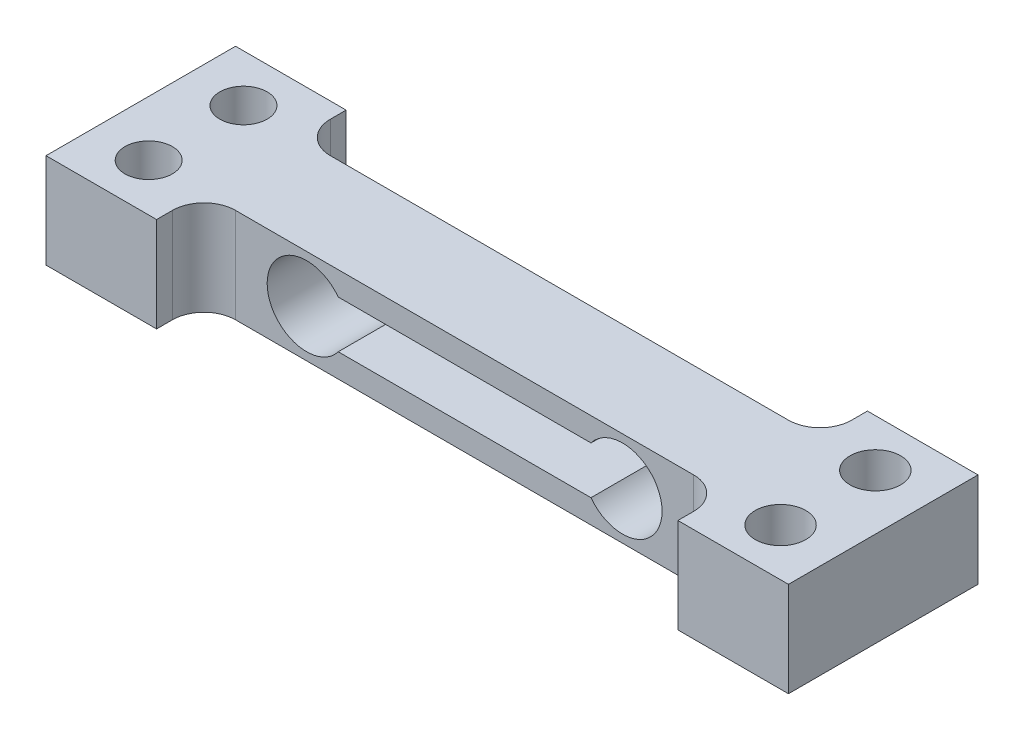
ISO-10303-21;
HEADER;
FILE_DESCRIPTION(('STEP AP214'),'2;1');
FILE_NAME('part.step','',(''),(''),'','','');
FILE_SCHEMA(('AUTOMOTIVE_DESIGN { 1 0 10303 214 1 1 1 1 }'));
ENDSEC;
DATA;
#1=APPLICATION_CONTEXT('core data for automotive mechanical design processes');
#2=APPLICATION_PROTOCOL_DEFINITION('international standard','automotive_design',2000,#1);
#3=PRODUCT_CONTEXT('',#1,'mechanical');
#4=PRODUCT('Part','Part','',(#3));
#5=PRODUCT_RELATED_PRODUCT_CATEGORY('part','',(#4));
#6=PRODUCT_DEFINITION_FORMATION('','',#4);
#7=PRODUCT_DEFINITION_CONTEXT('part definition',#1,'design');
#8=PRODUCT_DEFINITION('design','',#6,#7);
#9=PRODUCT_DEFINITION_SHAPE('','',#8);
#10=(LENGTH_UNIT() NAMED_UNIT(*) SI_UNIT(.MILLI.,.METRE.));
#11=(NAMED_UNIT(*) PLANE_ANGLE_UNIT() SI_UNIT($,.RADIAN.));
#12=(NAMED_UNIT(*) SI_UNIT($,.STERADIAN.) SOLID_ANGLE_UNIT());
#13=UNCERTAINTY_MEASURE_WITH_UNIT(LENGTH_MEASURE(1.E-05),#10,'distance_accuracy_value','');
#14=(GEOMETRIC_REPRESENTATION_CONTEXT(3) GLOBAL_UNCERTAINTY_ASSIGNED_CONTEXT((#13)) GLOBAL_UNIT_ASSIGNED_CONTEXT((#10,
#11,#12)) REPRESENTATION_CONTEXT('',''));
#15=CARTESIAN_POINT('',(0.,0.,0.));
#16=DIRECTION('',(0.,0.,1.));
#17=DIRECTION('',(1.,0.,0.));
#18=AXIS2_PLACEMENT_3D('',#15,#16,#17);
#19=CARTESIAN_POINT('',(9.,6.,-11.));
#20=DIRECTION('',(0.,1.,0.));
#21=DIRECTION('',(0.,0.,1.));
#22=AXIS2_PLACEMENT_3D('',#19,#20,#21);
#23=PLANE('',#22);
#24=CARTESIAN_POINT('',(43.5,6.,-9.));
#25=DIRECTION('',(0.,1.,0.));
#26=DIRECTION('',(0.,0.,1.));
#27=AXIS2_PLACEMENT_3D('',#24,#25,#26);
#28=CIRCLE('',#27,1.6);
#29=CARTESIAN_POINT('',(43.5,6.,-7.4));
#30=VERTEX_POINT('',#29);
#31=EDGE_CURVE('E220',#30,#30,#28,.T.);
#32=ORIENTED_EDGE('',*,*,#31,.F.);
#33=EDGE_LOOP('',(#32));
#34=FACE_BOUND('',#33,.T.);
#35=CARTESIAN_POINT('',(3.5,6.,-9.));
#36=DIRECTION('',(0.,1.,0.));
#37=DIRECTION('',(0.,0.,1.));
#38=AXIS2_PLACEMENT_3D('',#35,#36,#37);
#39=CIRCLE('',#38,1.5);
#40=CARTESIAN_POINT('',(3.5,6.,-7.5));
#41=VERTEX_POINT('',#40);
#42=EDGE_CURVE('E232',#41,#41,#39,.T.);
#43=ORIENTED_EDGE('',*,*,#42,.F.);
#44=EDGE_LOOP('',(#43));
#45=FACE_BOUND('',#44,.T.);
#46=DIRECTION('',(0.,0.,1.));
#47=VECTOR('',#46,1.);
#48=CARTESIAN_POINT('',(0.,6.,0.));
#49=LINE('',#48,#47);
#50=CARTESIAN_POINT('',(0.,6.,-12.));
#51=VERTEX_POINT('',#50);
#52=CARTESIAN_POINT('',(0.,6.,0.));
#53=VERTEX_POINT('',#52);
#54=EDGE_CURVE('E238',#51,#53,#49,.T.);
#55=ORIENTED_EDGE('',*,*,#54,.T.);
#56=DIRECTION('',(1.,0.,0.));
#57=VECTOR('',#56,1.);
#58=CARTESIAN_POINT('',(0.,6.,0.));
#59=LINE('',#58,#57);
#60=CARTESIAN_POINT('',(7.,6.,0.));
#61=VERTEX_POINT('',#60);
#62=EDGE_CURVE('E241',#53,#61,#59,.T.);
#63=ORIENTED_EDGE('',*,*,#62,.T.);
#64=DIRECTION('',(0.,0.,-1.));
#65=VECTOR('',#64,1.);
#66=CARTESIAN_POINT('',(7.,6.,0.));
#67=LINE('',#66,#65);
#68=CARTESIAN_POINT('',(7.,6.,-0.999999999999986));
#69=VERTEX_POINT('',#68);
#70=EDGE_CURVE('E244',#61,#69,#67,.T.);
#71=ORIENTED_EDGE('',*,*,#70,.T.);
#72=CARTESIAN_POINT('',(9.,6.,-1.));
#73=DIRECTION('',(0.,-1.,0.));
#74=DIRECTION('',(0.,0.,-1.));
#75=AXIS2_PLACEMENT_3D('',#72,#73,#74);
#76=CIRCLE('',#75,2.);
#77=CARTESIAN_POINT('',(9.,6.,-3.));
#78=VERTEX_POINT('',#77);
#79=EDGE_CURVE('E246',#69,#78,#76,.T.);
#80=ORIENTED_EDGE('',*,*,#79,.T.);
#81=DIRECTION('',(1.,0.,0.));
#82=VECTOR('',#81,1.);
#83=CARTESIAN_POINT('',(9.00000000000001,6.,-3.));
#84=LINE('',#83,#82);
#85=CARTESIAN_POINT('',(38.,6.,-3.));
#86=VERTEX_POINT('',#85);
#87=EDGE_CURVE('E248',#78,#86,#84,.T.);
#88=ORIENTED_EDGE('',*,*,#87,.T.);
#89=CARTESIAN_POINT('',(38.,6.,-1.));
#90=DIRECTION('',(0.,-1.,0.));
#91=DIRECTION('',(0.,0.,1.));
#92=AXIS2_PLACEMENT_3D('',#89,#90,#91);
#93=CIRCLE('',#92,2.);
#94=CARTESIAN_POINT('',(40.,6.,-0.999999999999986));
#95=VERTEX_POINT('',#94);
#96=EDGE_CURVE('E250',#86,#95,#93,.T.);
#97=ORIENTED_EDGE('',*,*,#96,.T.);
#98=DIRECTION('',(0.,0.,1.));
#99=VECTOR('',#98,1.);
#100=CARTESIAN_POINT('',(40.,6.,0.));
#101=LINE('',#100,#99);
#102=CARTESIAN_POINT('',(40.,6.,0.));
#103=VERTEX_POINT('',#102);
#104=EDGE_CURVE('E252',#95,#103,#101,.T.);
#105=ORIENTED_EDGE('',*,*,#104,.T.);
#106=DIRECTION('',(1.,0.,0.));
#107=VECTOR('',#106,1.);
#108=CARTESIAN_POINT('',(40.,6.,0.));
#109=LINE('',#108,#107);
#110=CARTESIAN_POINT('',(47.,6.,0.));
#111=VERTEX_POINT('',#110);
#112=EDGE_CURVE('E254',#103,#111,#109,.T.);
#113=ORIENTED_EDGE('',*,*,#112,.T.);
#114=DIRECTION('',(0.,0.,-1.));
#115=VECTOR('',#114,1.);
#116=CARTESIAN_POINT('',(47.,6.,0.));
#117=LINE('',#116,#115);
#118=CARTESIAN_POINT('',(47.,6.,-12.));
#119=VERTEX_POINT('',#118);
#120=EDGE_CURVE('E256',#111,#119,#117,.T.);
#121=ORIENTED_EDGE('',*,*,#120,.T.);
#122=DIRECTION('',(-1.,0.,0.));
#123=VECTOR('',#122,1.);
#124=CARTESIAN_POINT('',(40.,6.,-12.));
#125=LINE('',#124,#123);
#126=CARTESIAN_POINT('',(40.,6.,-12.));
#127=VERTEX_POINT('',#126);
#128=EDGE_CURVE('E258',#119,#127,#125,.T.);
#129=ORIENTED_EDGE('',*,*,#128,.T.);
#130=DIRECTION('',(0.,0.,1.));
#131=VECTOR('',#130,1.);
#132=CARTESIAN_POINT('',(40.,6.,-12.));
#133=LINE('',#132,#131);
#134=CARTESIAN_POINT('',(40.,6.,-11.));
#135=VERTEX_POINT('',#134);
#136=EDGE_CURVE('E260',#127,#135,#133,.T.);
#137=ORIENTED_EDGE('',*,*,#136,.T.);
#138=CARTESIAN_POINT('',(38.,6.,-11.));
#139=DIRECTION('',(0.,-1.,0.));
#140=DIRECTION('',(0.,0.,-1.));
#141=AXIS2_PLACEMENT_3D('',#138,#139,#140);
#142=CIRCLE('',#141,2.);
#143=CARTESIAN_POINT('',(38.,6.,-9.));
#144=VERTEX_POINT('',#143);
#145=EDGE_CURVE('E262',#135,#144,#142,.T.);
#146=ORIENTED_EDGE('',*,*,#145,.T.);
#147=DIRECTION('',(-1.,0.,0.));
#148=VECTOR('',#147,1.);
#149=CARTESIAN_POINT('',(9.00000000000001,6.,-9.));
#150=LINE('',#149,#148);
#151=CARTESIAN_POINT('',(9.00000000000001,6.,-9.));
#152=VERTEX_POINT('',#151);
#153=EDGE_CURVE('E264',#144,#152,#150,.T.);
#154=ORIENTED_EDGE('',*,*,#153,.T.);
#155=CARTESIAN_POINT('',(9.,6.,-11.));
#156=DIRECTION('',(0.,-1.,0.));
#157=DIRECTION('',(0.,0.,1.));
#158=AXIS2_PLACEMENT_3D('',#155,#156,#157);
#159=CIRCLE('',#158,2.);
#160=CARTESIAN_POINT('',(7.,6.,-11.));
#161=VERTEX_POINT('',#160);
#162=EDGE_CURVE('E266',#152,#161,#159,.T.);
#163=ORIENTED_EDGE('',*,*,#162,.T.);
#164=DIRECTION('',(0.,0.,-1.));
#165=VECTOR('',#164,1.);
#166=CARTESIAN_POINT('',(7.,6.,-12.));
#167=LINE('',#166,#165);
#168=CARTESIAN_POINT('',(7.,6.,-12.));
#169=VERTEX_POINT('',#168);
#170=EDGE_CURVE('E268',#161,#169,#167,.T.);
#171=ORIENTED_EDGE('',*,*,#170,.T.);
#172=DIRECTION('',(-1.,0.,0.));
#173=VECTOR('',#172,1.);
#174=CARTESIAN_POINT('',(0.,6.,-12.));
#175=LINE('',#174,#173);
#176=EDGE_CURVE('E270',#169,#51,#175,.T.);
#177=ORIENTED_EDGE('',*,*,#176,.T.);
#178=EDGE_LOOP('',(#55,#63,#71,#80,#88,#97,#105,#113,#121,#129,#137,#146,#154,#163,#171,#177));
#179=FACE_BOUND('',#178,.T.);
#180=CARTESIAN_POINT('',(3.5,6.,-3.));
#181=DIRECTION('',(0.,1.,0.));
#182=DIRECTION('',(0.,0.,1.));
#183=AXIS2_PLACEMENT_3D('',#180,#181,#182);
#184=CIRCLE('',#183,1.5);
#185=CARTESIAN_POINT('',(3.5,6.,-1.5));
#186=VERTEX_POINT('',#185);
#187=EDGE_CURVE('E226',#186,#186,#184,.T.);
#188=ORIENTED_EDGE('',*,*,#187,.F.);
#189=EDGE_LOOP('',(#188));
#190=FACE_BOUND('',#189,.T.);
#191=CARTESIAN_POINT('',(43.5,6.,-3.));
#192=DIRECTION('',(0.,1.,0.));
#193=DIRECTION('',(0.,0.,1.));
#194=AXIS2_PLACEMENT_3D('',#191,#192,#193);
#195=CIRCLE('',#194,1.6);
#196=CARTESIAN_POINT('',(43.5,6.,-1.4));
#197=VERTEX_POINT('',#196);
#198=EDGE_CURVE('E214',#197,#197,#195,.T.);
#199=ORIENTED_EDGE('',*,*,#198,.F.);
#200=EDGE_LOOP('',(#199));
#201=FACE_BOUND('',#200,.T.);
#202=ADVANCED_FACE('F39',(#34,#45,#179,#190,#201),#23,.T.);
#203=CARTESIAN_POINT('',(9.,0.,-11.));
#204=DIRECTION('',(0.,1.,0.));
#205=DIRECTION('',(0.,0.,1.));
#206=AXIS2_PLACEMENT_3D('',#203,#204,#205);
#207=PLANE('',#206);
#208=DIRECTION('',(0.,0.,1.));
#209=VECTOR('',#208,1.);
#210=CARTESIAN_POINT('',(0.,0.,0.));
#211=LINE('',#210,#209);
#212=CARTESIAN_POINT('',(0.,0.,-12.));
#213=VERTEX_POINT('',#212);
#214=CARTESIAN_POINT('',(0.,0.,0.));
#215=VERTEX_POINT('',#214);
#216=EDGE_CURVE('E235',#213,#215,#211,.T.);
#217=ORIENTED_EDGE('',*,*,#216,.F.);
#218=DIRECTION('',(-1.,0.,0.));
#219=VECTOR('',#218,1.);
#220=CARTESIAN_POINT('',(0.,0.,-12.));
#221=LINE('',#220,#219);
#222=CARTESIAN_POINT('',(7.,0.,-12.));
#223=VERTEX_POINT('',#222);
#224=EDGE_CURVE('E242',#223,#213,#221,.T.);
#225=ORIENTED_EDGE('',*,*,#224,.F.);
#226=DIRECTION('',(0.,0.,-1.));
#227=VECTOR('',#226,1.);
#228=CARTESIAN_POINT('',(7.,0.,-12.));
#229=LINE('',#228,#227);
#230=CARTESIAN_POINT('',(7.,0.,-11.));
#231=VERTEX_POINT('',#230);
#232=EDGE_CURVE('E301',#231,#223,#229,.T.);
#233=ORIENTED_EDGE('',*,*,#232,.F.);
#234=CARTESIAN_POINT('',(9.,0.,-11.));
#235=DIRECTION('',(0.,-1.,0.));
#236=DIRECTION('',(0.,0.,1.));
#237=AXIS2_PLACEMENT_3D('',#234,#235,#236);
#238=CIRCLE('',#237,2.);
#239=CARTESIAN_POINT('',(9.00000000000001,0.,-9.));
#240=VERTEX_POINT('',#239);
#241=EDGE_CURVE('E299',#240,#231,#238,.T.);
#242=ORIENTED_EDGE('',*,*,#241,.F.);
#243=DIRECTION('',(-1.,0.,0.));
#244=VECTOR('',#243,1.);
#245=CARTESIAN_POINT('',(9.00000000000001,0.,-9.));
#246=LINE('',#245,#244);
#247=CARTESIAN_POINT('',(38.,0.,-9.));
#248=VERTEX_POINT('',#247);
#249=EDGE_CURVE('E297',#248,#240,#246,.T.);
#250=ORIENTED_EDGE('',*,*,#249,.F.);
#251=CARTESIAN_POINT('',(38.,0.,-11.));
#252=DIRECTION('',(0.,-1.,0.));
#253=DIRECTION('',(0.,0.,-1.));
#254=AXIS2_PLACEMENT_3D('',#251,#252,#253);
#255=CIRCLE('',#254,2.);
#256=CARTESIAN_POINT('',(40.,0.,-11.));
#257=VERTEX_POINT('',#256);
#258=EDGE_CURVE('E295',#257,#248,#255,.T.);
#259=ORIENTED_EDGE('',*,*,#258,.F.);
#260=DIRECTION('',(0.,0.,1.));
#261=VECTOR('',#260,1.);
#262=CARTESIAN_POINT('',(40.,0.,-12.));
#263=LINE('',#262,#261);
#264=CARTESIAN_POINT('',(40.,0.,-12.));
#265=VERTEX_POINT('',#264);
#266=EDGE_CURVE('E293',#265,#257,#263,.T.);
#267=ORIENTED_EDGE('',*,*,#266,.F.);
#268=DIRECTION('',(-1.,0.,0.));
#269=VECTOR('',#268,1.);
#270=CARTESIAN_POINT('',(40.,0.,-12.));
#271=LINE('',#270,#269);
#272=CARTESIAN_POINT('',(47.,0.,-12.));
#273=VERTEX_POINT('',#272);
#274=EDGE_CURVE('E291',#273,#265,#271,.T.);
#275=ORIENTED_EDGE('',*,*,#274,.F.);
#276=DIRECTION('',(0.,0.,-1.));
#277=VECTOR('',#276,1.);
#278=CARTESIAN_POINT('',(47.,0.,0.));
#279=LINE('',#278,#277);
#280=CARTESIAN_POINT('',(47.,0.,0.));
#281=VERTEX_POINT('',#280);
#282=EDGE_CURVE('E289',#281,#273,#279,.T.);
#283=ORIENTED_EDGE('',*,*,#282,.F.);
#284=DIRECTION('',(1.,0.,0.));
#285=VECTOR('',#284,1.);
#286=CARTESIAN_POINT('',(40.,0.,0.));
#287=LINE('',#286,#285);
#288=CARTESIAN_POINT('',(40.,0.,0.));
#289=VERTEX_POINT('',#288);
#290=EDGE_CURVE('E287',#289,#281,#287,.T.);
#291=ORIENTED_EDGE('',*,*,#290,.F.);
#292=DIRECTION('',(0.,0.,1.));
#293=VECTOR('',#292,1.);
#294=CARTESIAN_POINT('',(40.,0.,0.));
#295=LINE('',#294,#293);
#296=CARTESIAN_POINT('',(40.,0.,-0.999999999999986));
#297=VERTEX_POINT('',#296);
#298=EDGE_CURVE('E285',#297,#289,#295,.T.);
#299=ORIENTED_EDGE('',*,*,#298,.F.);
#300=CARTESIAN_POINT('',(38.,0.,-1.));
#301=DIRECTION('',(0.,-1.,0.));
#302=DIRECTION('',(0.,0.,1.));
#303=AXIS2_PLACEMENT_3D('',#300,#301,#302);
#304=CIRCLE('',#303,2.);
#305=CARTESIAN_POINT('',(38.,0.,-3.));
#306=VERTEX_POINT('',#305);
#307=EDGE_CURVE('E283',#306,#297,#304,.T.);
#308=ORIENTED_EDGE('',*,*,#307,.F.);
#309=DIRECTION('',(1.,0.,0.));
#310=VECTOR('',#309,1.);
#311=CARTESIAN_POINT('',(9.00000000000001,0.,-3.));
#312=LINE('',#311,#310);
#313=CARTESIAN_POINT('',(9.,0.,-3.));
#314=VERTEX_POINT('',#313);
#315=EDGE_CURVE('E281',#314,#306,#312,.T.);
#316=ORIENTED_EDGE('',*,*,#315,.F.);
#317=CARTESIAN_POINT('',(9.,0.,-1.));
#318=DIRECTION('',(0.,-1.,0.));
#319=DIRECTION('',(0.,0.,-1.));
#320=AXIS2_PLACEMENT_3D('',#317,#318,#319);
#321=CIRCLE('',#320,2.);
#322=CARTESIAN_POINT('',(7.,0.,-0.999999999999986));
#323=VERTEX_POINT('',#322);
#324=EDGE_CURVE('E279',#323,#314,#321,.T.);
#325=ORIENTED_EDGE('',*,*,#324,.F.);
#326=DIRECTION('',(0.,0.,-1.));
#327=VECTOR('',#326,1.);
#328=CARTESIAN_POINT('',(7.,0.,0.));
#329=LINE('',#328,#327);
#330=CARTESIAN_POINT('',(7.,0.,0.));
#331=VERTEX_POINT('',#330);
#332=EDGE_CURVE('E277',#331,#323,#329,.T.);
#333=ORIENTED_EDGE('',*,*,#332,.F.);
#334=DIRECTION('',(1.,0.,0.));
#335=VECTOR('',#334,1.);
#336=CARTESIAN_POINT('',(0.,0.,0.));
#337=LINE('',#336,#335);
#338=EDGE_CURVE('E275',#215,#331,#337,.T.);
#339=ORIENTED_EDGE('',*,*,#338,.F.);
#340=EDGE_LOOP('',(#217,#225,#233,#242,#250,#259,#267,#275,#283,#291,#299,#308,#316,#325,#333,#339));
#341=FACE_BOUND('',#340,.T.);
#342=CARTESIAN_POINT('',(3.5,0.,-9.));
#343=DIRECTION('',(0.,1.,0.));
#344=DIRECTION('',(0.,0.,1.));
#345=AXIS2_PLACEMENT_3D('',#342,#343,#344);
#346=CIRCLE('',#345,1.5);
#347=CARTESIAN_POINT('',(3.5,0.,-7.5));
#348=VERTEX_POINT('',#347);
#349=EDGE_CURVE('E229',#348,#348,#346,.T.);
#350=ORIENTED_EDGE('',*,*,#349,.T.);
#351=EDGE_LOOP('',(#350));
#352=FACE_BOUND('',#351,.T.);
#353=CARTESIAN_POINT('',(3.5,0.,-3.));
#354=DIRECTION('',(0.,1.,0.));
#355=DIRECTION('',(0.,0.,1.));
#356=AXIS2_PLACEMENT_3D('',#353,#354,#355);
#357=CIRCLE('',#356,1.5);
#358=CARTESIAN_POINT('',(3.5,0.,-1.5));
#359=VERTEX_POINT('',#358);
#360=EDGE_CURVE('E223',#359,#359,#357,.T.);
#361=ORIENTED_EDGE('',*,*,#360,.T.);
#362=EDGE_LOOP('',(#361));
#363=FACE_BOUND('',#362,.T.);
#364=CARTESIAN_POINT('',(43.5,0.,-9.));
#365=DIRECTION('',(0.,1.,0.));
#366=DIRECTION('',(0.,0.,1.));
#367=AXIS2_PLACEMENT_3D('',#364,#365,#366);
#368=CIRCLE('',#367,1.6);
#369=CARTESIAN_POINT('',(43.5,0.,-7.4));
#370=VERTEX_POINT('',#369);
#371=EDGE_CURVE('E217',#370,#370,#368,.T.);
#372=ORIENTED_EDGE('',*,*,#371,.T.);
#373=EDGE_LOOP('',(#372));
#374=FACE_BOUND('',#373,.T.);
#375=CARTESIAN_POINT('',(43.5,0.,-3.));
#376=DIRECTION('',(0.,1.,0.));
#377=DIRECTION('',(0.,0.,1.));
#378=AXIS2_PLACEMENT_3D('',#375,#376,#377);
#379=CIRCLE('',#378,1.6);
#380=CARTESIAN_POINT('',(43.5,0.,-1.4));
#381=VERTEX_POINT('',#380);
#382=EDGE_CURVE('E213',#381,#381,#379,.T.);
#383=ORIENTED_EDGE('',*,*,#382,.T.);
#384=EDGE_LOOP('',(#383));
#385=FACE_BOUND('',#384,.T.);
#386=ADVANCED_FACE('F355',(#341,#352,#363,#374,#385),#207,.F.);
#387=CARTESIAN_POINT('',(0.,6.,0.));
#388=DIRECTION('',(1.,0.,0.));
#389=DIRECTION('',(0.,0.,-1.));
#390=AXIS2_PLACEMENT_3D('',#387,#388,#389);
#391=PLANE('',#390);
#392=ORIENTED_EDGE('',*,*,#216,.T.);
#393=DIRECTION('',(0.,-1.,0.));
#394=VECTOR('',#393,1.);
#395=CARTESIAN_POINT('',(0.,6.,0.));
#396=LINE('',#395,#394);
#397=EDGE_CURVE('E11',#53,#215,#396,.T.);
#398=ORIENTED_EDGE('',*,*,#397,.F.);
#399=ORIENTED_EDGE('',*,*,#54,.F.);
#400=DIRECTION('',(0.,-1.,0.));
#401=VECTOR('',#400,1.);
#402=CARTESIAN_POINT('',(0.,6.,-12.));
#403=LINE('',#402,#401);
#404=EDGE_CURVE('E272',#51,#213,#403,.T.);
#405=ORIENTED_EDGE('',*,*,#404,.T.);
#406=EDGE_LOOP('',(#392,#398,#399,#405));
#407=FACE_BOUND('',#406,.T.);
#408=ADVANCED_FACE('F41',(#407),#391,.F.);
#409=CARTESIAN_POINT('',(0.,6.,0.));
#410=DIRECTION('',(0.,0.,-1.));
#411=DIRECTION('',(-1.,0.,0.));
#412=AXIS2_PLACEMENT_3D('',#409,#410,#411);
#413=PLANE('',#412);
#414=ORIENTED_EDGE('',*,*,#338,.T.);
#415=DIRECTION('',(0.,-1.,0.));
#416=VECTOR('',#415,1.);
#417=CARTESIAN_POINT('',(7.,6.,0.));
#418=LINE('',#417,#416);
#419=EDGE_CURVE('E47',#61,#331,#418,.T.);
#420=ORIENTED_EDGE('',*,*,#419,.F.);
#421=ORIENTED_EDGE('',*,*,#62,.F.);
#422=ORIENTED_EDGE('',*,*,#397,.T.);
#423=EDGE_LOOP('',(#414,#420,#421,#422));
#424=FACE_BOUND('',#423,.T.);
#425=ADVANCED_FACE('F373',(#424),#413,.F.);
#426=CARTESIAN_POINT('',(7.,6.,0.));
#427=DIRECTION('',(-1.,0.,0.));
#428=DIRECTION('',(0.,0.,1.));
#429=AXIS2_PLACEMENT_3D('',#426,#427,#428);
#430=PLANE('',#429);
#431=ORIENTED_EDGE('',*,*,#332,.T.);
#432=DIRECTION('',(0.,-1.,0.));
#433=VECTOR('',#432,1.);
#434=CARTESIAN_POINT('',(7.,6.,-0.999999999999986));
#435=LINE('',#434,#433);
#436=EDGE_CURVE('E342',#69,#323,#435,.T.);
#437=ORIENTED_EDGE('',*,*,#436,.F.);
#438=ORIENTED_EDGE('',*,*,#70,.F.);
#439=ORIENTED_EDGE('',*,*,#419,.T.);
#440=EDGE_LOOP('',(#431,#437,#438,#439));
#441=FACE_BOUND('',#440,.T.);
#442=ADVANCED_FACE('F349',(#441),#430,.F.);
#443=CARTESIAN_POINT('',(9.,6.,-1.));
#444=DIRECTION('',(0.,-1.,0.));
#445=DIRECTION('',(0.,0.,-1.));
#446=AXIS2_PLACEMENT_3D('',#443,#444,#445);
#447=CYLINDRICAL_SURFACE('',#446,2.);
#448=ORIENTED_EDGE('',*,*,#324,.T.);
#449=DIRECTION('',(0.,-1.,0.));
#450=VECTOR('',#449,1.);
#451=CARTESIAN_POINT('',(9.,6.,-3.));
#452=LINE('',#451,#450);
#453=EDGE_CURVE('E339',#78,#314,#452,.T.);
#454=ORIENTED_EDGE('',*,*,#453,.F.);
#455=ORIENTED_EDGE('',*,*,#79,.F.);
#456=ORIENTED_EDGE('',*,*,#436,.T.);
#457=EDGE_LOOP('',(#448,#454,#455,#456));
#458=FACE_BOUND('',#457,.T.);
#459=ADVANCED_FACE('F361',(#458),#447,.F.);
#460=CARTESIAN_POINT('',(9.00000000000001,6.,-3.));
#461=DIRECTION('',(0.,0.,-1.));
#462=DIRECTION('',(-1.,0.,0.));
#463=AXIS2_PLACEMENT_3D('',#460,#461,#462);
#464=PLANE('',#463);
#465=CARTESIAN_POINT('',(33.5,3.,-3.));
#466=DIRECTION('',(0.,0.,-1.));
#467=DIRECTION('',(-1.,0.,0.));
#468=AXIS2_PLACEMENT_3D('',#465,#466,#467);
#469=CIRCLE('',#468,2.5);
#470=CARTESIAN_POINT('',(31.5,4.50000000000001,-3.));
#471=VERTEX_POINT('',#470);
#472=CARTESIAN_POINT('',(31.5,1.5,-3.));
#473=VERTEX_POINT('',#472);
#474=EDGE_CURVE('E207',#471,#473,#469,.T.);
#475=ORIENTED_EDGE('',*,*,#474,.T.);
#476=DIRECTION('',(-1.,0.,0.));
#477=VECTOR('',#476,1.);
#478=CARTESIAN_POINT('',(9.00000000000001,1.50000000000001,-3.));
#479=LINE('',#478,#477);
#480=CARTESIAN_POINT('',(15.5,1.50000000000001,-3.));
#481=VERTEX_POINT('',#480);
#482=EDGE_CURVE('E210',#473,#481,#479,.T.);
#483=ORIENTED_EDGE('',*,*,#482,.T.);
#484=CARTESIAN_POINT('',(13.5,3.,-3.));
#485=DIRECTION('',(0.,0.,-1.));
#486=DIRECTION('',(-1.,0.,0.));
#487=AXIS2_PLACEMENT_3D('',#484,#485,#486);
#488=CIRCLE('',#487,2.5);
#489=CARTESIAN_POINT('',(15.5,4.50000000000001,-3.));
#490=VERTEX_POINT('',#489);
#491=EDGE_CURVE('E202',#481,#490,#488,.T.);
#492=ORIENTED_EDGE('',*,*,#491,.T.);
#493=DIRECTION('',(-1.,0.,0.));
#494=VECTOR('',#493,1.);
#495=CARTESIAN_POINT('',(9.00000000000001,4.50000000000001,-3.));
#496=LINE('',#495,#494);
#497=EDGE_CURVE('E182',#471,#490,#496,.T.);
#498=ORIENTED_EDGE('',*,*,#497,.F.);
#499=EDGE_LOOP('',(#475,#483,#492,#498));
#500=FACE_BOUND('',#499,.T.);
#501=ORIENTED_EDGE('',*,*,#315,.T.);
#502=DIRECTION('',(0.,-1.,0.));
#503=VECTOR('',#502,1.);
#504=CARTESIAN_POINT('',(38.,6.,-3.));
#505=LINE('',#504,#503);
#506=EDGE_CURVE('E336',#86,#306,#505,.T.);
#507=ORIENTED_EDGE('',*,*,#506,.F.);
#508=ORIENTED_EDGE('',*,*,#87,.F.);
#509=ORIENTED_EDGE('',*,*,#453,.T.);
#510=EDGE_LOOP('',(#501,#507,#508,#509));
#511=FACE_BOUND('',#510,.T.);
#512=ADVANCED_FACE('F365',(#500,#511),#464,.F.);
#513=CARTESIAN_POINT('',(38.,6.,-1.));
#514=DIRECTION('',(0.,-1.,0.));
#515=DIRECTION('',(0.,0.,-1.));
#516=AXIS2_PLACEMENT_3D('',#513,#514,#515);
#517=CYLINDRICAL_SURFACE('',#516,2.);
#518=ORIENTED_EDGE('',*,*,#307,.T.);
#519=DIRECTION('',(0.,-1.,0.));
#520=VECTOR('',#519,1.);
#521=CARTESIAN_POINT('',(40.,6.,-0.999999999999986));
#522=LINE('',#521,#520);
#523=EDGE_CURVE('E333',#95,#297,#522,.T.);
#524=ORIENTED_EDGE('',*,*,#523,.F.);
#525=ORIENTED_EDGE('',*,*,#96,.F.);
#526=ORIENTED_EDGE('',*,*,#506,.T.);
#527=EDGE_LOOP('',(#518,#524,#525,#526));
#528=FACE_BOUND('',#527,.T.);
#529=ADVANCED_FACE('F424',(#528),#517,.F.);
#530=CARTESIAN_POINT('',(40.,6.,0.));
#531=DIRECTION('',(1.,0.,0.));
#532=DIRECTION('',(0.,0.,-1.));
#533=AXIS2_PLACEMENT_3D('',#530,#531,#532);
#534=PLANE('',#533);
#535=ORIENTED_EDGE('',*,*,#298,.T.);
#536=DIRECTION('',(0.,-1.,0.));
#537=VECTOR('',#536,1.);
#538=CARTESIAN_POINT('',(40.,6.,0.));
#539=LINE('',#538,#537);
#540=EDGE_CURVE('E330',#103,#289,#539,.T.);
#541=ORIENTED_EDGE('',*,*,#540,.F.);
#542=ORIENTED_EDGE('',*,*,#104,.F.);
#543=ORIENTED_EDGE('',*,*,#523,.T.);
#544=EDGE_LOOP('',(#535,#541,#542,#543));
#545=FACE_BOUND('',#544,.T.);
#546=ADVANCED_FACE('F421',(#545),#534,.F.);
#547=CARTESIAN_POINT('',(40.,6.,0.));
#548=DIRECTION('',(0.,0.,-1.));
#549=DIRECTION('',(-1.,0.,0.));
#550=AXIS2_PLACEMENT_3D('',#547,#548,#549);
#551=PLANE('',#550);
#552=ORIENTED_EDGE('',*,*,#290,.T.);
#553=DIRECTION('',(0.,-1.,0.));
#554=VECTOR('',#553,1.);
#555=CARTESIAN_POINT('',(47.,6.,0.));
#556=LINE('',#555,#554);
#557=EDGE_CURVE('E327',#111,#281,#556,.T.);
#558=ORIENTED_EDGE('',*,*,#557,.F.);
#559=ORIENTED_EDGE('',*,*,#112,.F.);
#560=ORIENTED_EDGE('',*,*,#540,.T.);
#561=EDGE_LOOP('',(#552,#558,#559,#560));
#562=FACE_BOUND('',#561,.T.);
#563=ADVANCED_FACE('F417',(#562),#551,.F.);
#564=CARTESIAN_POINT('',(47.,6.,0.));
#565=DIRECTION('',(-1.,0.,0.));
#566=DIRECTION('',(0.,0.,1.));
#567=AXIS2_PLACEMENT_3D('',#564,#565,#566);
#568=PLANE('',#567);
#569=ORIENTED_EDGE('',*,*,#282,.T.);
#570=DIRECTION('',(0.,-1.,0.));
#571=VECTOR('',#570,1.);
#572=CARTESIAN_POINT('',(47.,6.,-12.));
#573=LINE('',#572,#571);
#574=EDGE_CURVE('E324',#119,#273,#573,.T.);
#575=ORIENTED_EDGE('',*,*,#574,.F.);
#576=ORIENTED_EDGE('',*,*,#120,.F.);
#577=ORIENTED_EDGE('',*,*,#557,.T.);
#578=EDGE_LOOP('',(#569,#575,#576,#577));
#579=FACE_BOUND('',#578,.T.);
#580=ADVANCED_FACE('F413',(#579),#568,.F.);
#581=CARTESIAN_POINT('',(40.,6.,-12.));
#582=DIRECTION('',(0.,0.,1.));
#583=DIRECTION('',(1.,0.,0.));
#584=AXIS2_PLACEMENT_3D('',#581,#582,#583);
#585=PLANE('',#584);
#586=ORIENTED_EDGE('',*,*,#274,.T.);
#587=DIRECTION('',(0.,-1.,0.));
#588=VECTOR('',#587,1.);
#589=CARTESIAN_POINT('',(40.,6.,-12.));
#590=LINE('',#589,#588);
#591=EDGE_CURVE('E321',#127,#265,#590,.T.);
#592=ORIENTED_EDGE('',*,*,#591,.F.);
#593=ORIENTED_EDGE('',*,*,#128,.F.);
#594=ORIENTED_EDGE('',*,*,#574,.T.);
#595=EDGE_LOOP('',(#586,#592,#593,#594));
#596=FACE_BOUND('',#595,.T.);
#597=ADVANCED_FACE('F408',(#596),#585,.F.);
#598=CARTESIAN_POINT('',(40.,6.,-12.));
#599=DIRECTION('',(1.,0.,0.));
#600=DIRECTION('',(0.,0.,-1.));
#601=AXIS2_PLACEMENT_3D('',#598,#599,#600);
#602=PLANE('',#601);
#603=ORIENTED_EDGE('',*,*,#266,.T.);
#604=DIRECTION('',(0.,-1.,0.));
#605=VECTOR('',#604,1.);
#606=CARTESIAN_POINT('',(40.,6.,-11.));
#607=LINE('',#606,#605);
#608=EDGE_CURVE('E318',#135,#257,#607,.T.);
#609=ORIENTED_EDGE('',*,*,#608,.F.);
#610=ORIENTED_EDGE('',*,*,#136,.F.);
#611=ORIENTED_EDGE('',*,*,#591,.T.);
#612=EDGE_LOOP('',(#603,#609,#610,#611));
#613=FACE_BOUND('',#612,.T.);
#614=ADVANCED_FACE('F402',(#613),#602,.F.);
#615=CARTESIAN_POINT('',(38.,6.,-11.));
#616=DIRECTION('',(0.,-1.,0.));
#617=DIRECTION('',(0.,0.,-1.));
#618=AXIS2_PLACEMENT_3D('',#615,#616,#617);
#619=CYLINDRICAL_SURFACE('',#618,2.);
#620=ORIENTED_EDGE('',*,*,#258,.T.);
#621=DIRECTION('',(0.,-1.,0.));
#622=VECTOR('',#621,1.);
#623=CARTESIAN_POINT('',(38.,6.,-9.));
#624=LINE('',#623,#622);
#625=EDGE_CURVE('E315',#144,#248,#624,.T.);
#626=ORIENTED_EDGE('',*,*,#625,.F.);
#627=ORIENTED_EDGE('',*,*,#145,.F.);
#628=ORIENTED_EDGE('',*,*,#608,.T.);
#629=EDGE_LOOP('',(#620,#626,#627,#628));
#630=FACE_BOUND('',#629,.T.);
#631=ADVANCED_FACE('F398',(#630),#619,.F.);
#632=CARTESIAN_POINT('',(9.00000000000001,6.,-9.));
#633=DIRECTION('',(0.,0.,1.));
#634=DIRECTION('',(1.,0.,0.));
#635=AXIS2_PLACEMENT_3D('',#632,#633,#634);
#636=PLANE('',#635);
#637=CARTESIAN_POINT('',(13.5,3.,-9.));
#638=DIRECTION('',(0.,0.,-1.));
#639=DIRECTION('',(-1.,0.,0.));
#640=AXIS2_PLACEMENT_3D('',#637,#638,#639);
#641=CIRCLE('',#640,2.5);
#642=CARTESIAN_POINT('',(15.5,1.50000000000001,-9.));
#643=VERTEX_POINT('',#642);
#644=CARTESIAN_POINT('',(15.5,4.50000000000001,-9.));
#645=VERTEX_POINT('',#644);
#646=EDGE_CURVE('E188',#643,#645,#641,.T.);
#647=ORIENTED_EDGE('',*,*,#646,.F.);
#648=DIRECTION('',(-1.,0.,0.));
#649=VECTOR('',#648,1.);
#650=CARTESIAN_POINT('',(31.5,1.50000000000001,-9.));
#651=LINE('',#650,#649);
#652=CARTESIAN_POINT('',(31.5,1.5,-9.));
#653=VERTEX_POINT('',#652);
#654=EDGE_CURVE('E62',#653,#643,#651,.T.);
#655=ORIENTED_EDGE('',*,*,#654,.F.);
#656=CARTESIAN_POINT('',(33.5,3.,-9.));
#657=DIRECTION('',(0.,0.,-1.));
#658=DIRECTION('',(-1.,0.,0.));
#659=AXIS2_PLACEMENT_3D('',#656,#657,#658);
#660=CIRCLE('',#659,2.5);
#661=CARTESIAN_POINT('',(31.5,4.50000000000001,-9.));
#662=VERTEX_POINT('',#661);
#663=EDGE_CURVE('E195',#662,#653,#660,.T.);
#664=ORIENTED_EDGE('',*,*,#663,.F.);
#665=DIRECTION('',(-1.,0.,0.));
#666=VECTOR('',#665,1.);
#667=CARTESIAN_POINT('',(31.5,4.50000000000001,-9.));
#668=LINE('',#667,#666);
#669=EDGE_CURVE('E179',#662,#645,#668,.T.);
#670=ORIENTED_EDGE('',*,*,#669,.T.);
#671=EDGE_LOOP('',(#647,#655,#664,#670));
#672=FACE_BOUND('',#671,.T.);
#673=ORIENTED_EDGE('',*,*,#249,.T.);
#674=DIRECTION('',(0.,-1.,0.));
#675=VECTOR('',#674,1.);
#676=CARTESIAN_POINT('',(9.00000000000001,6.,-9.));
#677=LINE('',#676,#675);
#678=EDGE_CURVE('E312',#152,#240,#677,.T.);
#679=ORIENTED_EDGE('',*,*,#678,.F.);
#680=ORIENTED_EDGE('',*,*,#153,.F.);
#681=ORIENTED_EDGE('',*,*,#625,.T.);
#682=EDGE_LOOP('',(#673,#679,#680,#681));
#683=FACE_BOUND('',#682,.T.);
#684=ADVANCED_FACE('F192',(#672,#683),#636,.F.);
#685=CARTESIAN_POINT('',(9.,6.,-11.));
#686=DIRECTION('',(0.,-1.,0.));
#687=DIRECTION('',(0.,0.,-1.));
#688=AXIS2_PLACEMENT_3D('',#685,#686,#687);
#689=CYLINDRICAL_SURFACE('',#688,2.);
#690=ORIENTED_EDGE('',*,*,#241,.T.);
#691=DIRECTION('',(0.,-1.,0.));
#692=VECTOR('',#691,1.);
#693=CARTESIAN_POINT('',(7.,6.,-11.));
#694=LINE('',#693,#692);
#695=EDGE_CURVE('E309',#161,#231,#694,.T.);
#696=ORIENTED_EDGE('',*,*,#695,.F.);
#697=ORIENTED_EDGE('',*,*,#162,.F.);
#698=ORIENTED_EDGE('',*,*,#678,.T.);
#699=EDGE_LOOP('',(#690,#696,#697,#698));
#700=FACE_BOUND('',#699,.T.);
#701=ADVANCED_FACE('F389',(#700),#689,.F.);
#702=CARTESIAN_POINT('',(7.,6.,-12.));
#703=DIRECTION('',(-1.,0.,0.));
#704=DIRECTION('',(0.,0.,1.));
#705=AXIS2_PLACEMENT_3D('',#702,#703,#704);
#706=PLANE('',#705);
#707=ORIENTED_EDGE('',*,*,#232,.T.);
#708=DIRECTION('',(0.,-1.,0.));
#709=VECTOR('',#708,1.);
#710=CARTESIAN_POINT('',(7.,6.,-12.));
#711=LINE('',#710,#709);
#712=EDGE_CURVE('E306',#169,#223,#711,.T.);
#713=ORIENTED_EDGE('',*,*,#712,.F.);
#714=ORIENTED_EDGE('',*,*,#170,.F.);
#715=ORIENTED_EDGE('',*,*,#695,.T.);
#716=EDGE_LOOP('',(#707,#713,#714,#715));
#717=FACE_BOUND('',#716,.T.);
#718=ADVANCED_FACE('F385',(#717),#706,.F.);
#719=CARTESIAN_POINT('',(0.,6.,-12.));
#720=DIRECTION('',(0.,0.,1.));
#721=DIRECTION('',(1.,0.,0.));
#722=AXIS2_PLACEMENT_3D('',#719,#720,#721);
#723=PLANE('',#722);
#724=ORIENTED_EDGE('',*,*,#224,.T.);
#725=ORIENTED_EDGE('',*,*,#404,.F.);
#726=ORIENTED_EDGE('',*,*,#176,.F.);
#727=ORIENTED_EDGE('',*,*,#712,.T.);
#728=EDGE_LOOP('',(#724,#725,#726,#727));
#729=FACE_BOUND('',#728,.T.);
#730=ADVANCED_FACE('F380',(#729),#723,.F.);
#731=CARTESIAN_POINT('',(3.5,6.,-9.));
#732=DIRECTION('',(0.,-1.,0.));
#733=DIRECTION('',(0.,0.,-1.));
#734=AXIS2_PLACEMENT_3D('',#731,#732,#733);
#735=CYLINDRICAL_SURFACE('',#734,1.5);
#736=ORIENTED_EDGE('',*,*,#42,.T.);
#737=EDGE_LOOP('',(#736));
#738=FACE_BOUND('',#737,.T.);
#739=ORIENTED_EDGE('',*,*,#349,.F.);
#740=EDGE_LOOP('',(#739));
#741=FACE_BOUND('',#740,.T.);
#742=ADVANCED_FACE('F445',(#738,#741),#735,.F.);
#743=CARTESIAN_POINT('',(3.5,6.,-3.));
#744=DIRECTION('',(0.,-1.,0.));
#745=DIRECTION('',(0.,0.,-1.));
#746=AXIS2_PLACEMENT_3D('',#743,#744,#745);
#747=CYLINDRICAL_SURFACE('',#746,1.5);
#748=ORIENTED_EDGE('',*,*,#187,.T.);
#749=EDGE_LOOP('',(#748));
#750=FACE_BOUND('',#749,.T.);
#751=ORIENTED_EDGE('',*,*,#360,.F.);
#752=EDGE_LOOP('',(#751));
#753=FACE_BOUND('',#752,.T.);
#754=ADVANCED_FACE('F512',(#750,#753),#747,.F.);
#755=CARTESIAN_POINT('',(43.5,6.,-9.));
#756=DIRECTION('',(0.,-1.,0.));
#757=DIRECTION('',(0.,0.,-1.));
#758=AXIS2_PLACEMENT_3D('',#755,#756,#757);
#759=CYLINDRICAL_SURFACE('',#758,1.6);
#760=ORIENTED_EDGE('',*,*,#31,.T.);
#761=EDGE_LOOP('',(#760));
#762=FACE_BOUND('',#761,.T.);
#763=ORIENTED_EDGE('',*,*,#371,.F.);
#764=EDGE_LOOP('',(#763));
#765=FACE_BOUND('',#764,.T.);
#766=ADVANCED_FACE('F520',(#762,#765),#759,.F.);
#767=CARTESIAN_POINT('',(43.5,6.,-3.));
#768=DIRECTION('',(0.,-1.,0.));
#769=DIRECTION('',(0.,0.,-1.));
#770=AXIS2_PLACEMENT_3D('',#767,#768,#769);
#771=CYLINDRICAL_SURFACE('',#770,1.6);
#772=ORIENTED_EDGE('',*,*,#198,.T.);
#773=EDGE_LOOP('',(#772));
#774=FACE_BOUND('',#773,.T.);
#775=ORIENTED_EDGE('',*,*,#382,.F.);
#776=EDGE_LOOP('',(#775));
#777=FACE_BOUND('',#776,.T.);
#778=ADVANCED_FACE('F528',(#774,#777),#771,.F.);
#779=CARTESIAN_POINT('',(31.5,1.50000000000001,0.));
#780=DIRECTION('',(0.,-1.,0.));
#781=DIRECTION('',(0.,0.,-1.));
#782=AXIS2_PLACEMENT_3D('',#779,#780,#781);
#783=PLANE('',#782);
#784=DIRECTION('',(0.,0.,-1.));
#785=VECTOR('',#784,1.);
#786=CARTESIAN_POINT('',(31.5,1.5,0.));
#787=LINE('',#786,#785);
#788=EDGE_CURVE('E200',#473,#653,#787,.T.);
#789=ORIENTED_EDGE('',*,*,#788,.T.);
#790=ORIENTED_EDGE('',*,*,#654,.T.);
#791=DIRECTION('',(0.,0.,-1.));
#792=VECTOR('',#791,1.);
#793=CARTESIAN_POINT('',(15.5,1.50000000000001,0.));
#794=LINE('',#793,#792);
#795=EDGE_CURVE('E185',#481,#643,#794,.T.);
#796=ORIENTED_EDGE('',*,*,#795,.F.);
#797=ORIENTED_EDGE('',*,*,#482,.F.);
#798=EDGE_LOOP('',(#789,#790,#796,#797));
#799=FACE_BOUND('',#798,.T.);
#800=ADVANCED_FACE('F536',(#799),#783,.F.);
#801=CARTESIAN_POINT('',(33.5,3.,0.));
#802=DIRECTION('',(0.,0.,-1.));
#803=DIRECTION('',(-1.,0.,0.));
#804=AXIS2_PLACEMENT_3D('',#801,#802,#803);
#805=CYLINDRICAL_SURFACE('',#804,2.5);
#806=DIRECTION('',(0.,0.,-1.));
#807=VECTOR('',#806,1.);
#808=CARTESIAN_POINT('',(31.5,4.50000000000001,0.));
#809=LINE('',#808,#807);
#810=EDGE_CURVE('E184',#471,#662,#809,.T.);
#811=ORIENTED_EDGE('',*,*,#810,.T.);
#812=ORIENTED_EDGE('',*,*,#663,.T.);
#813=ORIENTED_EDGE('',*,*,#788,.F.);
#814=ORIENTED_EDGE('',*,*,#474,.F.);
#815=EDGE_LOOP('',(#811,#812,#813,#814));
#816=FACE_BOUND('',#815,.T.);
#817=ADVANCED_FACE('F556',(#816),#805,.F.);
#818=CARTESIAN_POINT('',(31.5,4.50000000000001,0.));
#819=DIRECTION('',(0.,-1.,0.));
#820=DIRECTION('',(0.,0.,-1.));
#821=AXIS2_PLACEMENT_3D('',#818,#819,#820);
#822=PLANE('',#821);
#823=ORIENTED_EDGE('',*,*,#497,.T.);
#824=DIRECTION('',(0.,0.,-1.));
#825=VECTOR('',#824,1.);
#826=CARTESIAN_POINT('',(15.5,4.50000000000001,0.));
#827=LINE('',#826,#825);
#828=EDGE_CURVE('E54',#490,#645,#827,.T.);
#829=ORIENTED_EDGE('',*,*,#828,.T.);
#830=ORIENTED_EDGE('',*,*,#669,.F.);
#831=ORIENTED_EDGE('',*,*,#810,.F.);
#832=EDGE_LOOP('',(#823,#829,#830,#831));
#833=FACE_BOUND('',#832,.T.);
#834=ADVANCED_FACE('F176',(#833),#822,.T.);
#835=CARTESIAN_POINT('',(13.5,3.,0.));
#836=DIRECTION('',(0.,0.,-1.));
#837=DIRECTION('',(-1.,0.,0.));
#838=AXIS2_PLACEMENT_3D('',#835,#836,#837);
#839=CYLINDRICAL_SURFACE('',#838,2.5);
#840=ORIENTED_EDGE('',*,*,#795,.T.);
#841=ORIENTED_EDGE('',*,*,#646,.T.);
#842=ORIENTED_EDGE('',*,*,#828,.F.);
#843=ORIENTED_EDGE('',*,*,#491,.F.);
#844=EDGE_LOOP('',(#840,#841,#842,#843));
#845=FACE_BOUND('',#844,.T.);
#846=ADVANCED_FACE('F189',(#845),#839,.F.);
#847=CLOSED_SHELL('',(#202,#386,#408,#425,#442,#459,#512,#529,#546,#563,#580,#597,#614,#631,
#684,#701,#718,#730,#742,#754,#766,#778,#800,#817,#834,#846));
#848=MANIFOLD_SOLID_BREP('B2',#847);
#849=ADVANCED_BREP_SHAPE_REPRESENTATION('',(#18,#848),#14);
#850=SHAPE_DEFINITION_REPRESENTATION(#9,#849);
ENDSEC;
END-ISO-10303-21;
